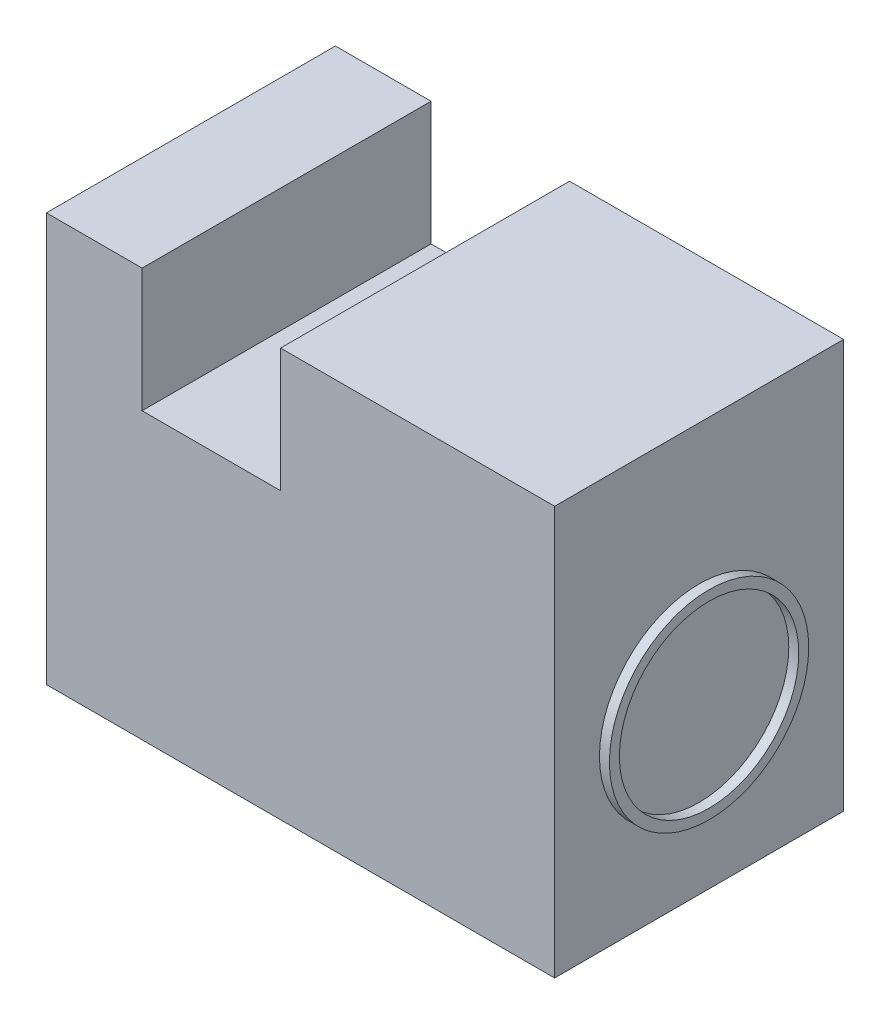
ISO-10303-21;
HEADER;
FILE_DESCRIPTION(('STEP AP214'),'2;1');
FILE_NAME('part.step','',(''),(''),'','','');
FILE_SCHEMA(('AUTOMOTIVE_DESIGN { 1 0 10303 214 1 1 1 1 }'));
ENDSEC;
DATA;
#1=APPLICATION_CONTEXT('core data for automotive mechanical design processes');
#2=APPLICATION_PROTOCOL_DEFINITION('international standard','automotive_design',2000,#1);
#3=PRODUCT_CONTEXT('',#1,'mechanical');
#4=PRODUCT('Part','Part','',(#3));
#5=PRODUCT_RELATED_PRODUCT_CATEGORY('part','',(#4));
#6=PRODUCT_DEFINITION_FORMATION('','',#4);
#7=PRODUCT_DEFINITION_CONTEXT('part definition',#1,'design');
#8=PRODUCT_DEFINITION('design','',#6,#7);
#9=PRODUCT_DEFINITION_SHAPE('','',#8);
#10=(LENGTH_UNIT() NAMED_UNIT(*) SI_UNIT(.MILLI.,.METRE.));
#11=(NAMED_UNIT(*) PLANE_ANGLE_UNIT() SI_UNIT($,.RADIAN.));
#12=(NAMED_UNIT(*) SI_UNIT($,.STERADIAN.) SOLID_ANGLE_UNIT());
#13=UNCERTAINTY_MEASURE_WITH_UNIT(LENGTH_MEASURE(1.E-05),#10,'distance_accuracy_value','');
#14=(GEOMETRIC_REPRESENTATION_CONTEXT(3) GLOBAL_UNCERTAINTY_ASSIGNED_CONTEXT((#13)) GLOBAL_UNIT_ASSIGNED_CONTEXT((#10,
#11,#12)) REPRESENTATION_CONTEXT('',''));
#15=CARTESIAN_POINT('',(0.,0.,0.));
#16=DIRECTION('',(0.,0.,1.));
#17=DIRECTION('',(1.,0.,0.));
#18=AXIS2_PLACEMENT_3D('',#15,#16,#17);
#19=CARTESIAN_POINT('',(0.,41.,0.));
#20=DIRECTION('',(0.,-1.,0.));
#21=DIRECTION('',(0.,0.,-1.));
#22=AXIS2_PLACEMENT_3D('',#19,#20,#21);
#23=PLANE('',#22);
#24=DIRECTION('',(1.,0.,0.));
#25=VECTOR('',#24,1.);
#26=CARTESIAN_POINT('',(-25.5,41.,14.5));
#27=LINE('',#26,#25);
#28=CARTESIAN_POINT('',(-25.5,41.,14.5));
#29=VERTEX_POINT('',#28);
#30=CARTESIAN_POINT('',(-15.9,41.,14.5));
#31=VERTEX_POINT('',#30);
#32=EDGE_CURVE('E169',#29,#31,#27,.T.);
#33=ORIENTED_EDGE('',*,*,#32,.T.);
#34=DIRECTION('',(0.,0.,1.));
#35=VECTOR('',#34,1.);
#36=CARTESIAN_POINT('',(-15.9,41.,-14.5));
#37=LINE('',#36,#35);
#38=CARTESIAN_POINT('',(-15.9,41.,-14.5));
#39=VERTEX_POINT('',#38);
#40=EDGE_CURVE('E149',#39,#31,#37,.T.);
#41=ORIENTED_EDGE('',*,*,#40,.F.);
#42=DIRECTION('',(-1.,0.,0.));
#43=VECTOR('',#42,1.);
#44=CARTESIAN_POINT('',(-25.5,41.,-14.5));
#45=LINE('',#44,#43);
#46=CARTESIAN_POINT('',(-25.5,41.,-14.5));
#47=VERTEX_POINT('',#46);
#48=EDGE_CURVE('E137',#39,#47,#45,.T.);
#49=ORIENTED_EDGE('',*,*,#48,.T.);
#50=DIRECTION('',(0.,0.,1.));
#51=VECTOR('',#50,1.);
#52=CARTESIAN_POINT('',(-25.5,41.,14.5));
#53=LINE('',#52,#51);
#54=EDGE_CURVE('E167',#47,#29,#53,.T.);
#55=ORIENTED_EDGE('',*,*,#54,.T.);
#56=EDGE_LOOP('',(#33,#41,#49,#55));
#57=FACE_BOUND('',#56,.T.);
#58=ADVANCED_FACE('F40',(#57),#23,.F.);
#59=CARTESIAN_POINT('',(25.5,41.,14.5));
#60=DIRECTION('',(-1.,0.,0.));
#61=DIRECTION('',(0.,0.,1.));
#62=AXIS2_PLACEMENT_3D('',#59,#60,#61);
#63=PLANE('',#62);
#64=CARTESIAN_POINT('',(25.5,17.,0.));
#65=DIRECTION('',(-1.,0.,0.));
#66=DIRECTION('',(0.,0.,1.));
#67=AXIS2_PLACEMENT_3D('',#64,#65,#66);
#68=CIRCLE('',#67,10.);
#69=CARTESIAN_POINT('',(25.5,17.,10.));
#70=VERTEX_POINT('',#69);
#71=EDGE_CURVE('E11',#70,#70,#68,.F.);
#72=ORIENTED_EDGE('',*,*,#71,.F.);
#73=EDGE_LOOP('',(#72));
#74=FACE_BOUND('',#73,.T.);
#75=DIRECTION('',(0.,0.,-1.));
#76=VECTOR('',#75,1.);
#77=CARTESIAN_POINT('',(25.5,0.,14.5));
#78=LINE('',#77,#76);
#79=CARTESIAN_POINT('',(25.5,0.,14.5));
#80=VERTEX_POINT('',#79);
#81=CARTESIAN_POINT('',(25.5,0.,-14.5));
#82=VERTEX_POINT('',#81);
#83=EDGE_CURVE('E163',#80,#82,#78,.T.);
#84=ORIENTED_EDGE('',*,*,#83,.T.);
#85=DIRECTION('',(0.,-1.,0.));
#86=VECTOR('',#85,1.);
#87=CARTESIAN_POINT('',(25.5,41.,-14.5));
#88=LINE('',#87,#86);
#89=CARTESIAN_POINT('',(25.5,41.,-14.5));
#90=VERTEX_POINT('',#89);
#91=EDGE_CURVE('E48',#90,#82,#88,.T.);
#92=ORIENTED_EDGE('',*,*,#91,.F.);
#93=DIRECTION('',(0.,0.,-1.));
#94=VECTOR('',#93,1.);
#95=CARTESIAN_POINT('',(25.5,41.,14.5));
#96=LINE('',#95,#94);
#97=CARTESIAN_POINT('',(25.5,41.,14.5));
#98=VERTEX_POINT('',#97);
#99=EDGE_CURVE('E164',#98,#90,#96,.T.);
#100=ORIENTED_EDGE('',*,*,#99,.F.);
#101=DIRECTION('',(0.,-1.,0.));
#102=VECTOR('',#101,1.);
#103=CARTESIAN_POINT('',(25.5,41.,14.5));
#104=LINE('',#103,#102);
#105=EDGE_CURVE('E172',#98,#80,#104,.T.);
#106=ORIENTED_EDGE('',*,*,#105,.T.);
#107=EDGE_LOOP('',(#84,#92,#100,#106));
#108=FACE_BOUND('',#107,.T.);
#109=ADVANCED_FACE('F42',(#74,#108),#63,.F.);
#110=CARTESIAN_POINT('',(-25.5,41.,-14.5));
#111=DIRECTION('',(0.,0.,1.));
#112=DIRECTION('',(1.,0.,0.));
#113=AXIS2_PLACEMENT_3D('',#110,#111,#112);
#114=PLANE('',#113);
#115=CARTESIAN_POINT('',(18.5,34.,-14.5));
#116=DIRECTION('',(0.,0.,-1.));
#117=DIRECTION('',(-1.,0.,0.));
#118=AXIS2_PLACEMENT_3D('',#115,#116,#117);
#119=CIRCLE('',#118,1.5);
#120=CARTESIAN_POINT('',(17.,34.,-14.5));
#121=VERTEX_POINT('',#120);
#122=EDGE_CURVE('E406',#121,#121,#119,.T.);
#123=ORIENTED_EDGE('',*,*,#122,.F.);
#124=EDGE_LOOP('',(#123));
#125=FACE_BOUND('',#124,.T.);
#126=CARTESIAN_POINT('',(-18.5,7.,-14.5));
#127=DIRECTION('',(0.,0.,-1.));
#128=DIRECTION('',(-1.,0.,0.));
#129=AXIS2_PLACEMENT_3D('',#126,#127,#128);
#130=CIRCLE('',#129,1.5);
#131=CARTESIAN_POINT('',(-20.,7.,-14.5));
#132=VERTEX_POINT('',#131);
#133=EDGE_CURVE('E409',#132,#132,#130,.T.);
#134=ORIENTED_EDGE('',*,*,#133,.F.);
#135=EDGE_LOOP('',(#134));
#136=FACE_BOUND('',#135,.T.);
#137=ORIENTED_EDGE('',*,*,#48,.F.);
#138=DIRECTION('',(0.,-1.,0.));
#139=VECTOR('',#138,1.);
#140=CARTESIAN_POINT('',(-15.9,41.,-14.5));
#141=LINE('',#140,#139);
#142=CARTESIAN_POINT('',(-15.9,28.6,-14.5));
#143=VERTEX_POINT('',#142);
#144=EDGE_CURVE('E119',#39,#143,#141,.T.);
#145=ORIENTED_EDGE('',*,*,#144,.T.);
#146=DIRECTION('',(1.,0.,0.));
#147=VECTOR('',#146,1.);
#148=CARTESIAN_POINT('',(-15.9,28.6,-14.5));
#149=LINE('',#148,#147);
#150=CARTESIAN_POINT('',(-2.00000000000001,28.6,-14.5));
#151=VERTEX_POINT('',#150);
#152=EDGE_CURVE('E130',#143,#151,#149,.T.);
#153=ORIENTED_EDGE('',*,*,#152,.T.);
#154=DIRECTION('',(0.,1.,0.));
#155=VECTOR('',#154,1.);
#156=CARTESIAN_POINT('',(-2.00000000000001,41.,-14.5));
#157=LINE('',#156,#155);
#158=CARTESIAN_POINT('',(-2.00000000000001,41.,-14.5));
#159=VERTEX_POINT('',#158);
#160=EDGE_CURVE('E127',#151,#159,#157,.T.);
#161=ORIENTED_EDGE('',*,*,#160,.T.);
#162=EDGE_CURVE('E93',#90,#159,#45,.T.);
#163=ORIENTED_EDGE('',*,*,#162,.F.);
#164=ORIENTED_EDGE('',*,*,#91,.T.);
#165=DIRECTION('',(-1.,0.,0.));
#166=VECTOR('',#165,1.);
#167=CARTESIAN_POINT('',(-25.5,0.,-14.5));
#168=LINE('',#167,#166);
#169=CARTESIAN_POINT('',(-25.5,0.,-14.5));
#170=VERTEX_POINT('',#169);
#171=EDGE_CURVE('E175',#82,#170,#168,.T.);
#172=ORIENTED_EDGE('',*,*,#171,.T.);
#173=DIRECTION('',(0.,-1.,0.));
#174=VECTOR('',#173,1.);
#175=CARTESIAN_POINT('',(-25.5,41.,-14.5));
#176=LINE('',#175,#174);
#177=EDGE_CURVE('E183',#47,#170,#176,.T.);
#178=ORIENTED_EDGE('',*,*,#177,.F.);
#179=EDGE_LOOP('',(#137,#145,#153,#161,#163,#164,#172,#178));
#180=FACE_BOUND('',#179,.T.);
#181=ADVANCED_FACE('F135',(#125,#136,#180),#114,.F.);
#182=CARTESIAN_POINT('',(-25.5,41.,14.5));
#183=DIRECTION('',(1.,0.,0.));
#184=DIRECTION('',(0.,0.,-1.));
#185=AXIS2_PLACEMENT_3D('',#182,#183,#184);
#186=PLANE('',#185);
#187=DIRECTION('',(0.,0.,1.));
#188=VECTOR('',#187,1.);
#189=CARTESIAN_POINT('',(-25.5,0.,14.5));
#190=LINE('',#189,#188);
#191=CARTESIAN_POINT('',(-25.5,0.,14.5));
#192=VERTEX_POINT('',#191);
#193=EDGE_CURVE('E177',#170,#192,#190,.T.);
#194=ORIENTED_EDGE('',*,*,#193,.T.);
#195=DIRECTION('',(0.,-1.,0.));
#196=VECTOR('',#195,1.);
#197=CARTESIAN_POINT('',(-25.5,41.,14.5));
#198=LINE('',#197,#196);
#199=EDGE_CURVE('E181',#29,#192,#198,.T.);
#200=ORIENTED_EDGE('',*,*,#199,.F.);
#201=ORIENTED_EDGE('',*,*,#54,.F.);
#202=ORIENTED_EDGE('',*,*,#177,.T.);
#203=EDGE_LOOP('',(#194,#200,#201,#202));
#204=FACE_BOUND('',#203,.T.);
#205=ADVANCED_FACE('F194',(#204),#186,.F.);
#206=CARTESIAN_POINT('',(-25.5,41.,14.5));
#207=DIRECTION('',(0.,0.,-1.));
#208=DIRECTION('',(-1.,0.,0.));
#209=AXIS2_PLACEMENT_3D('',#206,#207,#208);
#210=PLANE('',#209);
#211=DIRECTION('',(1.,0.,0.));
#212=VECTOR('',#211,1.);
#213=CARTESIAN_POINT('',(-15.9,28.6,14.5));
#214=LINE('',#213,#212);
#215=CARTESIAN_POINT('',(-15.9,28.6,14.5));
#216=VERTEX_POINT('',#215);
#217=CARTESIAN_POINT('',(-2.00000000000001,28.6,14.5));
#218=VERTEX_POINT('',#217);
#219=EDGE_CURVE('E139',#216,#218,#214,.T.);
#220=ORIENTED_EDGE('',*,*,#219,.F.);
#221=DIRECTION('',(0.,-1.,0.));
#222=VECTOR('',#221,1.);
#223=CARTESIAN_POINT('',(-15.9,41.,14.5));
#224=LINE('',#223,#222);
#225=EDGE_CURVE('E122',#31,#216,#224,.T.);
#226=ORIENTED_EDGE('',*,*,#225,.F.);
#227=ORIENTED_EDGE('',*,*,#32,.F.);
#228=ORIENTED_EDGE('',*,*,#199,.T.);
#229=DIRECTION('',(1.,0.,0.));
#230=VECTOR('',#229,1.);
#231=CARTESIAN_POINT('',(-25.5,0.,14.5));
#232=LINE('',#231,#230);
#233=EDGE_CURVE('E85',#192,#80,#232,.T.);
#234=ORIENTED_EDGE('',*,*,#233,.T.);
#235=ORIENTED_EDGE('',*,*,#105,.F.);
#236=CARTESIAN_POINT('',(-2.00000000000001,41.,14.5));
#237=VERTEX_POINT('',#236);
#238=EDGE_CURVE('E63',#237,#98,#27,.T.);
#239=ORIENTED_EDGE('',*,*,#238,.F.);
#240=DIRECTION('',(0.,1.,0.));
#241=VECTOR('',#240,1.);
#242=CARTESIAN_POINT('',(-2.00000000000001,41.,14.5));
#243=LINE('',#242,#241);
#244=EDGE_CURVE('E55',#218,#237,#243,.T.);
#245=ORIENTED_EDGE('',*,*,#244,.F.);
#246=EDGE_LOOP('',(#220,#226,#227,#228,#234,#235,#239,#245));
#247=FACE_BOUND('',#246,.T.);
#248=ADVANCED_FACE('F197',(#247),#210,.F.);
#249=ORIENTED_EDGE('',*,*,#162,.T.);
#250=DIRECTION('',(0.,0.,1.));
#251=VECTOR('',#250,1.);
#252=CARTESIAN_POINT('',(-2.00000000000001,41.,-14.5));
#253=LINE('',#252,#251);
#254=EDGE_CURVE('E152',#159,#237,#253,.T.);
#255=ORIENTED_EDGE('',*,*,#254,.T.);
#256=ORIENTED_EDGE('',*,*,#238,.T.);
#257=ORIENTED_EDGE('',*,*,#99,.T.);
#258=EDGE_LOOP('',(#249,#255,#256,#257));
#259=FACE_BOUND('',#258,.T.);
#260=ADVANCED_FACE('F201',(#259),#23,.F.);
#261=CARTESIAN_POINT('',(0.,0.,0.));
#262=DIRECTION('',(0.,-1.,0.));
#263=DIRECTION('',(0.,0.,-1.));
#264=AXIS2_PLACEMENT_3D('',#261,#262,#263);
#265=PLANE('',#264);
#266=ORIENTED_EDGE('',*,*,#83,.F.);
#267=ORIENTED_EDGE('',*,*,#233,.F.);
#268=ORIENTED_EDGE('',*,*,#193,.F.);
#269=ORIENTED_EDGE('',*,*,#171,.F.);
#270=EDGE_LOOP('',(#266,#267,#268,#269));
#271=FACE_BOUND('',#270,.T.);
#272=ADVANCED_FACE('F190',(#271),#265,.T.);
#273=CARTESIAN_POINT('',(26.5,17.,0.));
#274=DIRECTION('',(1.,0.,0.));
#275=DIRECTION('',(0.,0.,-1.));
#276=AXIS2_PLACEMENT_3D('',#273,#274,#275);
#277=PLANE('',#276);
#278=CARTESIAN_POINT('',(26.5,17.,0.));
#279=DIRECTION('',(1.,0.,0.));
#280=DIRECTION('',(0.,0.,-1.));
#281=AXIS2_PLACEMENT_3D('',#278,#279,#280);
#282=CIRCLE('',#281,10.);
#283=CARTESIAN_POINT('',(26.5,17.,-10.));
#284=VERTEX_POINT('',#283);
#285=EDGE_CURVE('E158',#284,#284,#282,.T.);
#286=ORIENTED_EDGE('',*,*,#285,.T.);
#287=EDGE_LOOP('',(#286));
#288=FACE_BOUND('',#287,.T.);
#289=CARTESIAN_POINT('',(26.5,17.,0.));
#290=DIRECTION('',(1.,0.,0.));
#291=DIRECTION('',(0.,0.,-1.));
#292=AXIS2_PLACEMENT_3D('',#289,#290,#291);
#293=CIRCLE('',#292,9.);
#294=CARTESIAN_POINT('',(26.5,17.,-9.));
#295=VERTEX_POINT('',#294);
#296=EDGE_CURVE('E155',#295,#295,#293,.T.);
#297=ORIENTED_EDGE('',*,*,#296,.F.);
#298=EDGE_LOOP('',(#297));
#299=FACE_BOUND('',#298,.T.);
#300=ADVANCED_FACE('F214',(#288,#299),#277,.T.);
#301=CARTESIAN_POINT('',(26.5,17.,0.));
#302=DIRECTION('',(-1.,0.,0.));
#303=DIRECTION('',(0.,0.,1.));
#304=AXIS2_PLACEMENT_3D('',#301,#302,#303);
#305=CYLINDRICAL_SURFACE('',#304,10.);
#306=ORIENTED_EDGE('',*,*,#285,.F.);
#307=EDGE_LOOP('',(#306));
#308=FACE_BOUND('',#307,.T.);
#309=ORIENTED_EDGE('',*,*,#71,.T.);
#310=EDGE_LOOP('',(#309));
#311=FACE_BOUND('',#310,.T.);
#312=ADVANCED_FACE('F233',(#308,#311),#305,.T.);
#313=CARTESIAN_POINT('',(26.5,17.,0.));
#314=DIRECTION('',(-1.,0.,0.));
#315=DIRECTION('',(0.,0.,1.));
#316=AXIS2_PLACEMENT_3D('',#313,#314,#315);
#317=CYLINDRICAL_SURFACE('',#316,9.);
#318=ORIENTED_EDGE('',*,*,#296,.T.);
#319=EDGE_LOOP('',(#318));
#320=FACE_BOUND('',#319,.T.);
#321=CARTESIAN_POINT('',(25.5,17.,0.));
#322=DIRECTION('',(1.,0.,0.));
#323=DIRECTION('',(0.,0.,-1.));
#324=AXIS2_PLACEMENT_3D('',#321,#322,#323);
#325=CIRCLE('',#324,9.);
#326=CARTESIAN_POINT('',(25.5,17.,-9.));
#327=VERTEX_POINT('',#326);
#328=EDGE_CURVE('E151',#327,#327,#325,.T.);
#329=ORIENTED_EDGE('',*,*,#328,.F.);
#330=EDGE_LOOP('',(#329));
#331=FACE_BOUND('',#330,.T.);
#332=ADVANCED_FACE('F230',(#320,#331),#317,.F.);
#333=ORIENTED_EDGE('',*,*,#328,.T.);
#334=EDGE_LOOP('',(#333));
#335=FACE_BOUND('',#334,.T.);
#336=ADVANCED_FACE('F206',(#335),#63,.F.);
#337=CARTESIAN_POINT('',(-15.9,41.,-14.5));
#338=DIRECTION('',(-1.,0.,0.));
#339=DIRECTION('',(0.,0.,1.));
#340=AXIS2_PLACEMENT_3D('',#337,#338,#339);
#341=PLANE('',#340);
#342=ORIENTED_EDGE('',*,*,#225,.T.);
#343=DIRECTION('',(0.,0.,1.));
#344=VECTOR('',#343,1.);
#345=CARTESIAN_POINT('',(-15.9,28.6,-14.5));
#346=LINE('',#345,#344);
#347=EDGE_CURVE('E115',#143,#216,#346,.T.);
#348=ORIENTED_EDGE('',*,*,#347,.F.);
#349=ORIENTED_EDGE('',*,*,#144,.F.);
#350=ORIENTED_EDGE('',*,*,#40,.T.);
#351=EDGE_LOOP('',(#342,#348,#349,#350));
#352=FACE_BOUND('',#351,.T.);
#353=ADVANCED_FACE('F117',(#352),#341,.F.);
#354=CARTESIAN_POINT('',(-2.00000000000001,41.,-14.5));
#355=DIRECTION('',(1.,0.,0.));
#356=DIRECTION('',(0.,1.,0.));
#357=AXIS2_PLACEMENT_3D('',#354,#355,#356);
#358=PLANE('',#357);
#359=ORIENTED_EDGE('',*,*,#244,.T.);
#360=ORIENTED_EDGE('',*,*,#254,.F.);
#361=ORIENTED_EDGE('',*,*,#160,.F.);
#362=DIRECTION('',(0.,0.,1.));
#363=VECTOR('',#362,1.);
#364=CARTESIAN_POINT('',(-2.00000000000001,28.6,-14.5));
#365=LINE('',#364,#363);
#366=EDGE_CURVE('E126',#151,#218,#365,.T.);
#367=ORIENTED_EDGE('',*,*,#366,.T.);
#368=EDGE_LOOP('',(#359,#360,#361,#367));
#369=FACE_BOUND('',#368,.T.);
#370=ADVANCED_FACE('F216',(#369),#358,.F.);
#371=CARTESIAN_POINT('',(-15.9,28.6,-14.5));
#372=DIRECTION('',(0.,-1.,0.));
#373=DIRECTION('',(0.,0.,-1.));
#374=AXIS2_PLACEMENT_3D('',#371,#372,#373);
#375=PLANE('',#374);
#376=ORIENTED_EDGE('',*,*,#219,.T.);
#377=ORIENTED_EDGE('',*,*,#366,.F.);
#378=ORIENTED_EDGE('',*,*,#152,.F.);
#379=ORIENTED_EDGE('',*,*,#347,.T.);
#380=EDGE_LOOP('',(#376,#377,#378,#379));
#381=FACE_BOUND('',#380,.T.);
#382=ADVANCED_FACE('F131',(#381),#375,.F.);
#383=CARTESIAN_POINT('',(-18.5,7.,-9.49999999999998));
#384=DIRECTION('',(0.,0.,-1.));
#385=DIRECTION('',(-1.,0.,0.));
#386=AXIS2_PLACEMENT_3D('',#383,#384,#385);
#387=CYLINDRICAL_SURFACE('',#386,1.5);
#388=CARTESIAN_POINT('',(-18.5,7.,-9.49999999999998));
#389=DIRECTION('',(0.,0.,-1.));
#390=DIRECTION('',(-1.,0.,0.));
#391=AXIS2_PLACEMENT_3D('',#388,#389,#390);
#392=CIRCLE('',#391,1.5);
#393=CARTESIAN_POINT('',(-20.,7.,-9.49999999999998));
#394=VERTEX_POINT('',#393);
#395=EDGE_CURVE('E142',#394,#394,#392,.T.);
#396=ORIENTED_EDGE('',*,*,#395,.F.);
#397=EDGE_LOOP('',(#396));
#398=FACE_BOUND('',#397,.T.);
#399=ORIENTED_EDGE('',*,*,#133,.T.);
#400=EDGE_LOOP('',(#399));
#401=FACE_BOUND('',#400,.T.);
#402=ADVANCED_FACE('F223',(#398,#401),#387,.F.);
#403=CARTESIAN_POINT('',(-18.5,7.,-9.49999999999998));
#404=DIRECTION('',(0.,0.,-1.));
#405=DIRECTION('',(-1.,0.,0.));
#406=AXIS2_PLACEMENT_3D('',#403,#404,#405);
#407=PLANE('',#406);
#408=ORIENTED_EDGE('',*,*,#395,.T.);
#409=EDGE_LOOP('',(#408));
#410=FACE_BOUND('',#409,.T.);
#411=ADVANCED_FACE('F227',(#410),#407,.T.);
#412=CARTESIAN_POINT('',(18.5,34.,-9.49999999999998));
#413=DIRECTION('',(0.,0.,-1.));
#414=DIRECTION('',(-1.,0.,0.));
#415=AXIS2_PLACEMENT_3D('',#412,#413,#414);
#416=CYLINDRICAL_SURFACE('',#415,1.5);
#417=CARTESIAN_POINT('',(18.5,34.,-9.49999999999998));
#418=DIRECTION('',(0.,0.,-1.));
#419=DIRECTION('',(-1.,0.,0.));
#420=AXIS2_PLACEMENT_3D('',#417,#418,#419);
#421=CIRCLE('',#420,1.5);
#422=CARTESIAN_POINT('',(17.,34.,-9.49999999999998));
#423=VERTEX_POINT('',#422);
#424=EDGE_CURVE('E147',#423,#423,#421,.T.);
#425=ORIENTED_EDGE('',*,*,#424,.F.);
#426=EDGE_LOOP('',(#425));
#427=FACE_BOUND('',#426,.T.);
#428=ORIENTED_EDGE('',*,*,#122,.T.);
#429=EDGE_LOOP('',(#428));
#430=FACE_BOUND('',#429,.T.);
#431=ADVANCED_FACE('F305',(#427,#430),#416,.F.);
#432=CARTESIAN_POINT('',(18.5,34.,-9.49999999999998));
#433=DIRECTION('',(0.,0.,-1.));
#434=DIRECTION('',(-1.,0.,0.));
#435=AXIS2_PLACEMENT_3D('',#432,#433,#434);
#436=PLANE('',#435);
#437=ORIENTED_EDGE('',*,*,#424,.T.);
#438=EDGE_LOOP('',(#437));
#439=FACE_BOUND('',#438,.T.);
#440=ADVANCED_FACE('F315',(#439),#436,.T.);
#441=CLOSED_SHELL('',(#58,#109,#181,#205,#248,#260,#272,#300,#312,#332,#336,#353,#370,#382,#402,
#411,#431,#440));
#442=MANIFOLD_SOLID_BREP('B2',#441);
#443=ADVANCED_BREP_SHAPE_REPRESENTATION('',(#18,#442),#14);
#444=SHAPE_DEFINITION_REPRESENTATION(#9,#443);
ENDSEC;
END-ISO-10303-21;
